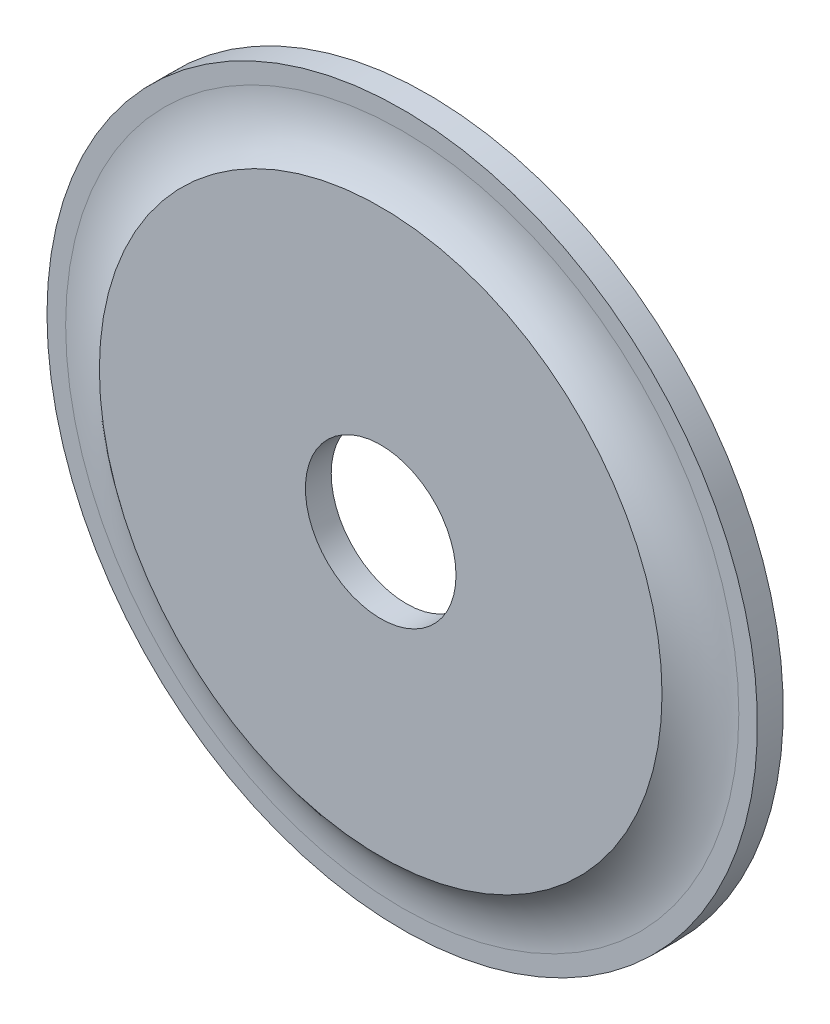
ISO-10303-21;
HEADER;
FILE_DESCRIPTION(('STEP AP214'),'2;1');
FILE_NAME('part.step','',(''),(''),'','','');
FILE_SCHEMA(('AUTOMOTIVE_DESIGN { 1 0 10303 214 1 1 1 1 }'));
ENDSEC;
DATA;
#1=APPLICATION_CONTEXT('core data for automotive mechanical design processes');
#2=APPLICATION_PROTOCOL_DEFINITION('international standard','automotive_design',2000,#1);
#3=PRODUCT_CONTEXT('',#1,'mechanical');
#4=PRODUCT('Part','Part','',(#3));
#5=PRODUCT_RELATED_PRODUCT_CATEGORY('part','',(#4));
#6=PRODUCT_DEFINITION_FORMATION('','',#4);
#7=PRODUCT_DEFINITION_CONTEXT('part definition',#1,'design');
#8=PRODUCT_DEFINITION('design','',#6,#7);
#9=PRODUCT_DEFINITION_SHAPE('','',#8);
#10=(LENGTH_UNIT() NAMED_UNIT(*) SI_UNIT(.MILLI.,.METRE.));
#11=(NAMED_UNIT(*) PLANE_ANGLE_UNIT() SI_UNIT($,.RADIAN.));
#12=(NAMED_UNIT(*) SI_UNIT($,.STERADIAN.) SOLID_ANGLE_UNIT());
#13=UNCERTAINTY_MEASURE_WITH_UNIT(LENGTH_MEASURE(1.E-05),#10,'distance_accuracy_value','');
#14=(GEOMETRIC_REPRESENTATION_CONTEXT(3) GLOBAL_UNCERTAINTY_ASSIGNED_CONTEXT((#13)) GLOBAL_UNIT_ASSIGNED_CONTEXT((#10,
#11,#12)) REPRESENTATION_CONTEXT('',''));
#15=CARTESIAN_POINT('',(0.,0.,0.));
#16=DIRECTION('',(0.,0.,1.));
#17=DIRECTION('',(1.,0.,0.));
#18=AXIS2_PLACEMENT_3D('',#15,#16,#17);
#19=CARTESIAN_POINT('',(0.,0.,0.25));
#20=DIRECTION('',(0.,0.,1.));
#21=DIRECTION('',(1.,0.,0.));
#22=AXIS2_PLACEMENT_3D('',#19,#20,#21);
#23=PLANE('',#22);
#24=CARTESIAN_POINT('',(0.,0.,0.25));
#25=DIRECTION('',(0.,0.,1.));
#26=DIRECTION('',(1.,0.,0.));
#27=AXIS2_PLACEMENT_3D('',#24,#25,#26);
#28=CIRCLE('',#27,3.25);
#29=CARTESIAN_POINT('',(3.25,0.,0.25));
#30=VERTEX_POINT('',#29);
#31=EDGE_CURVE('E72',#30,#30,#28,.T.);
#32=ORIENTED_EDGE('',*,*,#31,.F.);
#33=EDGE_LOOP('',(#32));
#34=FACE_BOUND('',#33,.T.);
#35=CARTESIAN_POINT('',(0.,0.,0.25));
#36=DIRECTION('',(0.,0.,1.));
#37=DIRECTION('',(1.,0.,0.));
#38=AXIS2_PLACEMENT_3D('',#35,#36,#37);
#39=CIRCLE('',#38,1.21341845900312);
#40=CARTESIAN_POINT('',(1.21341845900312,0.,0.25));
#41=VERTEX_POINT('',#40);
#42=EDGE_CURVE('E51',#41,#41,#39,.F.);
#43=ORIENTED_EDGE('',*,*,#42,.F.);
#44=EDGE_LOOP('',(#43));
#45=FACE_BOUND('',#44,.T.);
#46=ADVANCED_FACE('F39',(#34,#45),#23,.F.);
#47=CARTESIAN_POINT('',(0.,0.,0.3));
#48=DIRECTION('',(0.,0.,1.));
#49=DIRECTION('',(1.,0.,0.));
#50=AXIS2_PLACEMENT_3D('',#47,#48,#49);
#51=PLANE('',#50);
#52=CARTESIAN_POINT('',(0.,0.,0.3));
#53=DIRECTION('',(0.,0.,1.));
#54=DIRECTION('',(1.,0.,0.));
#55=AXIS2_PLACEMENT_3D('',#52,#53,#54);
#56=CIRCLE('',#55,0.875);
#57=CARTESIAN_POINT('',(0.875,0.,0.3));
#58=VERTEX_POINT('',#57);
#59=EDGE_CURVE('E79',#58,#58,#56,.T.);
#60=ORIENTED_EDGE('',*,*,#59,.F.);
#61=EDGE_LOOP('',(#60));
#62=FACE_BOUND('',#61,.T.);
#63=CARTESIAN_POINT('',(0.,0.,0.3));
#64=DIRECTION('',(0.,0.,-1.));
#65=DIRECTION('',(-1.,0.,0.));
#66=AXIS2_PLACEMENT_3D('',#63,#64,#65);
#67=CIRCLE('',#66,3.26917619883289);
#68=CARTESIAN_POINT('',(-3.26917619883289,0.,0.3));
#69=VERTEX_POINT('',#68);
#70=EDGE_CURVE('E61',#69,#69,#67,.F.);
#71=ORIENTED_EDGE('',*,*,#70,.T.);
#72=EDGE_LOOP('',(#71));
#73=FACE_BOUND('',#72,.T.);
#74=ADVANCED_FACE('F103',(#62,#73),#51,.T.);
#75=CARTESIAN_POINT('',(0.,0.,-0.25));
#76=DIRECTION('',(0.,0.,1.));
#77=DIRECTION('',(1.,0.,0.));
#78=AXIS2_PLACEMENT_3D('',#75,#76,#77);
#79=CYLINDRICAL_SURFACE('',#78,4.12829891588554);
#80=CARTESIAN_POINT('',(0.,0.,-0.25));
#81=DIRECTION('',(0.,0.,-1.));
#82=DIRECTION('',(-1.,0.,0.));
#83=AXIS2_PLACEMENT_3D('',#80,#81,#82);
#84=CIRCLE('',#83,4.12829891588554);
#85=CARTESIAN_POINT('',(-4.12829891588554,0.,-0.25));
#86=VERTEX_POINT('',#85);
#87=EDGE_CURVE('E58',#86,#86,#84,.T.);
#88=ORIENTED_EDGE('',*,*,#87,.F.);
#89=EDGE_LOOP('',(#88));
#90=FACE_BOUND('',#89,.T.);
#91=CARTESIAN_POINT('',(0.,0.,0.05));
#92=DIRECTION('',(0.,0.,-1.));
#93=DIRECTION('',(-1.,0.,0.));
#94=AXIS2_PLACEMENT_3D('',#91,#92,#93);
#95=CIRCLE('',#94,4.12829891588554);
#96=CARTESIAN_POINT('',(-4.12829891588554,0.,0.05));
#97=VERTEX_POINT('',#96);
#98=EDGE_CURVE('E62',#97,#97,#95,.T.);
#99=ORIENTED_EDGE('',*,*,#98,.T.);
#100=EDGE_LOOP('',(#99));
#101=FACE_BOUND('',#100,.T.);
#102=ADVANCED_FACE('F109',(#90,#101),#79,.T.);
#103=CARTESIAN_POINT('',(0.,0.,-0.25));
#104=DIRECTION('',(0.,0.,-1.));
#105=DIRECTION('',(-1.,0.,0.));
#106=AXIS2_PLACEMENT_3D('',#103,#104,#105);
#107=PLANE('',#106);
#108=CARTESIAN_POINT('',(0.,0.,-0.25));
#109=DIRECTION('',(0.,0.,-1.));
#110=DIRECTION('',(-1.,0.,0.));
#111=AXIS2_PLACEMENT_3D('',#108,#109,#110);
#112=CIRCLE('',#111,4.07829891588554);
#113=CARTESIAN_POINT('',(-4.07829891588554,0.,-0.25));
#114=VERTEX_POINT('',#113);
#115=EDGE_CURVE('E75',#114,#114,#112,.T.);
#116=ORIENTED_EDGE('',*,*,#115,.F.);
#117=EDGE_LOOP('',(#116));
#118=FACE_BOUND('',#117,.T.);
#119=ORIENTED_EDGE('',*,*,#87,.T.);
#120=EDGE_LOOP('',(#119));
#121=FACE_BOUND('',#120,.T.);
#122=ADVANCED_FACE('F122',(#118,#121),#107,.T.);
#123=CARTESIAN_POINT('',(0.,0.,0.05));
#124=DIRECTION('',(0.,0.,-1.));
#125=DIRECTION('',(-1.,0.,0.));
#126=AXIS2_PLACEMENT_3D('',#123,#124,#125);
#127=PLANE('',#126);
#128=CARTESIAN_POINT('',(0.,0.,0.05));
#129=DIRECTION('',(0.,0.,-1.));
#130=DIRECTION('',(-1.,0.,0.));
#131=AXIS2_PLACEMENT_3D('',#128,#129,#130);
#132=CIRCLE('',#131,3.91143782776615);
#133=CARTESIAN_POINT('',(-3.91143782776615,0.,0.05));
#134=VERTEX_POINT('',#133);
#135=EDGE_CURVE('E55',#134,#134,#132,.T.);
#136=ORIENTED_EDGE('',*,*,#135,.T.);
#137=EDGE_LOOP('',(#136));
#138=FACE_BOUND('',#137,.T.);
#139=ORIENTED_EDGE('',*,*,#98,.F.);
#140=EDGE_LOOP('',(#139));
#141=FACE_BOUND('',#140,.T.);
#142=ADVANCED_FACE('F124',(#138,#141),#127,.F.);
#143=CARTESIAN_POINT('',(0.,0.,1.));
#144=DIRECTION('',(0.,0.,-1.));
#145=DIRECTION('',(-1.,0.,0.));
#146=AXIS2_PLACEMENT_3D('',#143,#144,#145);
#147=TOROIDAL_SURFACE('',#146,3.91143782776615,0.95);
#148=ORIENTED_EDGE('',*,*,#135,.F.);
#149=EDGE_LOOP('',(#148));
#150=FACE_BOUND('',#149,.T.);
#151=ORIENTED_EDGE('',*,*,#70,.F.);
#152=EDGE_LOOP('',(#151));
#153=FACE_BOUND('',#152,.T.);
#154=ADVANCED_FACE('F129',(#150,#153),#147,.F.);
#155=CARTESIAN_POINT('',(0.,0.,-0.25));
#156=DIRECTION('',(0.,0.,1.));
#157=DIRECTION('',(1.,0.,0.));
#158=AXIS2_PLACEMENT_3D('',#155,#156,#157);
#159=CYLINDRICAL_SURFACE('',#158,4.07829891588554);
#160=ORIENTED_EDGE('',*,*,#115,.T.);
#161=EDGE_LOOP('',(#160));
#162=FACE_BOUND('',#161,.T.);
#163=CARTESIAN_POINT('',(0.,0.,0.));
#164=DIRECTION('',(0.,0.,-1.));
#165=DIRECTION('',(-1.,0.,0.));
#166=AXIS2_PLACEMENT_3D('',#163,#164,#165);
#167=CIRCLE('',#166,4.07829891588554);
#168=CARTESIAN_POINT('',(-4.07829891588554,0.,0.));
#169=VERTEX_POINT('',#168);
#170=EDGE_CURVE('E76',#169,#169,#167,.T.);
#171=ORIENTED_EDGE('',*,*,#170,.F.);
#172=EDGE_LOOP('',(#171));
#173=FACE_BOUND('',#172,.T.);
#174=ADVANCED_FACE('F116',(#162,#173),#159,.F.);
#175=CARTESIAN_POINT('',(0.,0.,0.));
#176=DIRECTION('',(0.,0.,-1.));
#177=DIRECTION('',(-1.,0.,0.));
#178=AXIS2_PLACEMENT_3D('',#175,#176,#177);
#179=PLANE('',#178);
#180=CARTESIAN_POINT('',(0.,0.,0.));
#181=DIRECTION('',(0.,0.,-1.));
#182=DIRECTION('',(-1.,0.,0.));
#183=AXIS2_PLACEMENT_3D('',#180,#181,#182);
#184=CIRCLE('',#183,3.91143782776615);
#185=CARTESIAN_POINT('',(-3.91143782776615,0.,0.));
#186=VERTEX_POINT('',#185);
#187=EDGE_CURVE('E65',#186,#186,#184,.T.);
#188=ORIENTED_EDGE('',*,*,#187,.F.);
#189=EDGE_LOOP('',(#188));
#190=FACE_BOUND('',#189,.T.);
#191=ORIENTED_EDGE('',*,*,#170,.T.);
#192=EDGE_LOOP('',(#191));
#193=FACE_BOUND('',#192,.T.);
#194=ADVANCED_FACE('F120',(#190,#193),#179,.T.);
#195=CARTESIAN_POINT('',(0.,0.,1.));
#196=DIRECTION('',(0.,0.,-1.));
#197=DIRECTION('',(-1.,0.,0.));
#198=AXIS2_PLACEMENT_3D('',#195,#196,#197);
#199=TOROIDAL_SURFACE('',#198,3.91143782776615,1.);
#200=ORIENTED_EDGE('',*,*,#187,.T.);
#201=EDGE_LOOP('',(#200));
#202=FACE_BOUND('',#201,.T.);
#203=ORIENTED_EDGE('',*,*,#31,.T.);
#204=EDGE_LOOP('',(#203));
#205=FACE_BOUND('',#204,.T.);
#206=ADVANCED_FACE('F99',(#202,#205),#199,.T.);
#207=CARTESIAN_POINT('',(0.,0.,-1.95));
#208=DIRECTION('',(0.,0.,1.));
#209=DIRECTION('',(1.,0.,0.));
#210=AXIS2_PLACEMENT_3D('',#207,#208,#209);
#211=CYLINDRICAL_SURFACE('',#210,0.875);
#212=ORIENTED_EDGE('',*,*,#59,.T.);
#213=EDGE_LOOP('',(#212));
#214=FACE_BOUND('',#213,.T.);
#215=CARTESIAN_POINT('',(0.,0.,0.));
#216=DIRECTION('',(0.,0.,-1.));
#217=DIRECTION('',(-1.,0.,0.));
#218=AXIS2_PLACEMENT_3D('',#215,#216,#217);
#219=CIRCLE('',#218,0.875);
#220=CARTESIAN_POINT('',(-0.875,0.,0.));
#221=VERTEX_POINT('',#220);
#222=EDGE_CURVE('E84',#221,#221,#219,.T.);
#223=ORIENTED_EDGE('',*,*,#222,.T.);
#224=EDGE_LOOP('',(#223));
#225=FACE_BOUND('',#224,.T.);
#226=ADVANCED_FACE('F88',(#214,#225),#211,.F.);
#227=CARTESIAN_POINT('',(0.,0.,0.));
#228=DIRECTION('',(0.,0.,-1.));
#229=DIRECTION('',(-1.,0.,0.));
#230=AXIS2_PLACEMENT_3D('',#227,#228,#229);
#231=PLANE('',#230);
#232=CARTESIAN_POINT('',(0.,0.,0.));
#233=DIRECTION('',(0.,0.,-1.));
#234=DIRECTION('',(-1.,0.,0.));
#235=AXIS2_PLACEMENT_3D('',#232,#233,#234);
#236=CIRCLE('',#235,1.01341845900312);
#237=CARTESIAN_POINT('',(-1.01341845900312,0.,0.));
#238=VERTEX_POINT('',#237);
#239=EDGE_CURVE('E47',#238,#238,#236,.T.);
#240=ORIENTED_EDGE('',*,*,#239,.T.);
#241=EDGE_LOOP('',(#240));
#242=FACE_BOUND('',#241,.T.);
#243=ORIENTED_EDGE('',*,*,#222,.F.);
#244=EDGE_LOOP('',(#243));
#245=FACE_BOUND('',#244,.T.);
#246=ADVANCED_FACE('F90',(#242,#245),#231,.T.);
#247=CARTESIAN_POINT('',(0.,0.,0.));
#248=DIRECTION('',(0.,0.,1.));
#249=DIRECTION('',(1.,0.,0.));
#250=AXIS2_PLACEMENT_3D('',#247,#248,#249);
#251=CYLINDRICAL_SURFACE('',#250,1.21341845900312);
#252=CARTESIAN_POINT('',(0.,0.,0.200000000000001));
#253=DIRECTION('',(0.,0.,-1.));
#254=DIRECTION('',(-1.,0.,0.));
#255=AXIS2_PLACEMENT_3D('',#252,#253,#254);
#256=CIRCLE('',#255,1.21341845900312);
#257=CARTESIAN_POINT('',(-1.21341845900312,0.,0.200000000000001));
#258=VERTEX_POINT('',#257);
#259=EDGE_CURVE('E10',#258,#258,#256,.F.);
#260=ORIENTED_EDGE('',*,*,#259,.T.);
#261=EDGE_LOOP('',(#260));
#262=FACE_BOUND('',#261,.T.);
#263=ORIENTED_EDGE('',*,*,#42,.T.);
#264=EDGE_LOOP('',(#263));
#265=FACE_BOUND('',#264,.T.);
#266=ADVANCED_FACE('F92',(#262,#265),#251,.T.);
#267=CARTESIAN_POINT('',(0.,0.,0.));
#268=DIRECTION('',(0.,0.,1.));
#269=DIRECTION('',(1.,0.,0.));
#270=AXIS2_PLACEMENT_3D('',#267,#268,#269);
#271=CONICAL_SURFACE('',#270,1.01341845900312,0.785398163397447);
#272=ORIENTED_EDGE('',*,*,#259,.F.);
#273=EDGE_LOOP('',(#272));
#274=FACE_BOUND('',#273,.T.);
#275=ORIENTED_EDGE('',*,*,#239,.F.);
#276=EDGE_LOOP('',(#275));
#277=FACE_BOUND('',#276,.T.);
#278=ADVANCED_FACE('F42',(#274,#277),#271,.T.);
#279=CLOSED_SHELL('',(#46,#74,#102,#122,#142,#154,#174,#194,#206,#226,#246,#266,#278));
#280=MANIFOLD_SOLID_BREP('B2',#279);
#281=ADVANCED_BREP_SHAPE_REPRESENTATION('',(#18,#280),#14);
#282=SHAPE_DEFINITION_REPRESENTATION(#9,#281);
ENDSEC;
END-ISO-10303-21;
